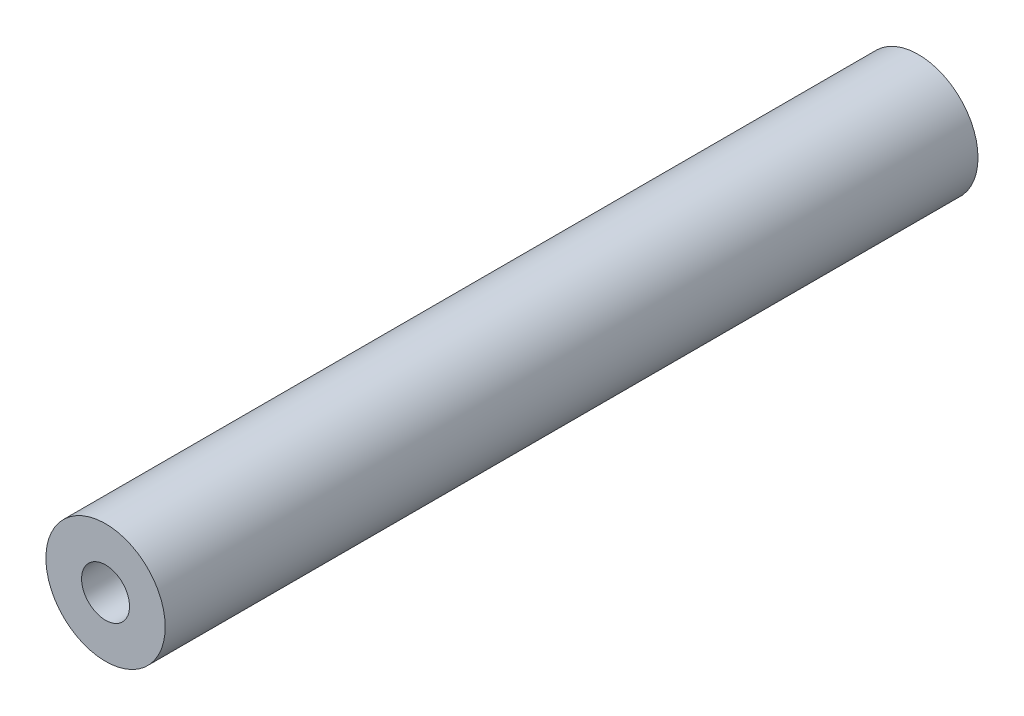
ISO-10303-21;
HEADER;
FILE_DESCRIPTION(('STEP AP214'),'2;1');
FILE_NAME('part.step','',(''),(''),'','','');
FILE_SCHEMA(('AUTOMOTIVE_DESIGN { 1 0 10303 214 1 1 1 1 }'));
ENDSEC;
DATA;
#1=APPLICATION_CONTEXT('core data for automotive mechanical design processes');
#2=APPLICATION_PROTOCOL_DEFINITION('international standard','automotive_design',2000,#1);
#3=PRODUCT_CONTEXT('',#1,'mechanical');
#4=PRODUCT('Part','Part','',(#3));
#5=PRODUCT_RELATED_PRODUCT_CATEGORY('part','',(#4));
#6=PRODUCT_DEFINITION_FORMATION('','',#4);
#7=PRODUCT_DEFINITION_CONTEXT('part definition',#1,'design');
#8=PRODUCT_DEFINITION('design','',#6,#7);
#9=PRODUCT_DEFINITION_SHAPE('','',#8);
#10=(LENGTH_UNIT() NAMED_UNIT(*) SI_UNIT(.MILLI.,.METRE.));
#11=(NAMED_UNIT(*) PLANE_ANGLE_UNIT() SI_UNIT($,.RADIAN.));
#12=(NAMED_UNIT(*) SI_UNIT($,.STERADIAN.) SOLID_ANGLE_UNIT());
#13=UNCERTAINTY_MEASURE_WITH_UNIT(LENGTH_MEASURE(1.E-05),#10,'distance_accuracy_value','');
#14=(GEOMETRIC_REPRESENTATION_CONTEXT(3) GLOBAL_UNCERTAINTY_ASSIGNED_CONTEXT((#13)) GLOBAL_UNIT_ASSIGNED_CONTEXT((#10,
#11,#12)) REPRESENTATION_CONTEXT('',''));
#15=CARTESIAN_POINT('',(0.,0.,0.));
#16=DIRECTION('',(0.,0.,1.));
#17=DIRECTION('',(1.,0.,0.));
#18=AXIS2_PLACEMENT_3D('',#15,#16,#17);
#19=CARTESIAN_POINT('',(0.,0.,43.258347316));
#20=DIRECTION('',(0.,0.,-1.));
#21=DIRECTION('',(-1.,0.,0.));
#22=AXIS2_PLACEMENT_3D('',#19,#20,#21);
#23=CYLINDRICAL_SURFACE('',#22,6.35);
#24=CARTESIAN_POINT('',(0.,0.,43.258347316));
#25=DIRECTION('',(0.,0.,1.));
#26=DIRECTION('',(1.,0.,0.));
#27=AXIS2_PLACEMENT_3D('',#24,#25,#26);
#28=CIRCLE('',#27,6.35);
#29=CARTESIAN_POINT('',(6.35,0.,43.258347316));
#30=VERTEX_POINT('',#29);
#31=EDGE_CURVE('E11',#30,#30,#28,.T.);
#32=ORIENTED_EDGE('',*,*,#31,.F.);
#33=EDGE_LOOP('',(#32));
#34=FACE_BOUND('',#33,.T.);
#35=CARTESIAN_POINT('',(0.,0.,-43.258347316));
#36=DIRECTION('',(0.,0.,1.));
#37=DIRECTION('',(1.,0.,0.));
#38=AXIS2_PLACEMENT_3D('',#35,#36,#37);
#39=CIRCLE('',#38,6.35);
#40=CARTESIAN_POINT('',(6.35,0.,-43.258347316));
#41=VERTEX_POINT('',#40);
#42=EDGE_CURVE('E38',#41,#41,#39,.T.);
#43=ORIENTED_EDGE('',*,*,#42,.T.);
#44=EDGE_LOOP('',(#43));
#45=FACE_BOUND('',#44,.T.);
#46=ADVANCED_FACE('F35',(#34,#45),#23,.T.);
#47=CARTESIAN_POINT('',(0.,0.,43.258347316));
#48=DIRECTION('',(0.,0.,1.));
#49=DIRECTION('',(1.,0.,0.));
#50=AXIS2_PLACEMENT_3D('',#47,#48,#49);
#51=PLANE('',#50);
#52=CARTESIAN_POINT('',(0.,0.,43.258347316));
#53=DIRECTION('',(0.,0.,1.));
#54=DIRECTION('',(1.,0.,0.));
#55=AXIS2_PLACEMENT_3D('',#52,#53,#54);
#56=CIRCLE('',#55,2.55269999999999);
#57=CARTESIAN_POINT('',(2.55269999999999,0.,43.258347316));
#58=VERTEX_POINT('',#57);
#59=EDGE_CURVE('E58',#58,#58,#56,.T.);
#60=ORIENTED_EDGE('',*,*,#59,.F.);
#61=EDGE_LOOP('',(#60));
#62=FACE_BOUND('',#61,.T.);
#63=ORIENTED_EDGE('',*,*,#31,.T.);
#64=EDGE_LOOP('',(#63));
#65=FACE_BOUND('',#64,.T.);
#66=ADVANCED_FACE('F77',(#62,#65),#51,.T.);
#67=CARTESIAN_POINT('',(0.,0.,-43.258347316));
#68=DIRECTION('',(0.,0.,1.));
#69=DIRECTION('',(1.,0.,0.));
#70=AXIS2_PLACEMENT_3D('',#67,#68,#69);
#71=PLANE('',#70);
#72=CARTESIAN_POINT('',(0.,0.,-43.258347316));
#73=DIRECTION('',(0.,0.,-1.));
#74=DIRECTION('',(-1.,0.,0.));
#75=AXIS2_PLACEMENT_3D('',#72,#73,#74);
#76=CIRCLE('',#75,2.55269999999999);
#77=CARTESIAN_POINT('',(-2.55269999999999,0.,-43.258347316));
#78=VERTEX_POINT('',#77);
#79=EDGE_CURVE('E59',#78,#78,#76,.T.);
#80=ORIENTED_EDGE('',*,*,#79,.F.);
#81=EDGE_LOOP('',(#80));
#82=FACE_BOUND('',#81,.T.);
#83=ORIENTED_EDGE('',*,*,#42,.F.);
#84=EDGE_LOOP('',(#83));
#85=FACE_BOUND('',#84,.T.);
#86=ADVANCED_FACE('F74',(#82,#85),#71,.F.);
#87=CARTESIAN_POINT('',(0.,0.,27.383347316));
#88=DIRECTION('',(0.,0.,1.));
#89=DIRECTION('',(1.,0.,0.));
#90=AXIS2_PLACEMENT_3D('',#87,#88,#89);
#91=CONICAL_SURFACE('',#90,2.5527,1.02974425867665);
#92=CARTESIAN_POINT('',(0.,0.,25.8495304138083));
#93=VERTEX_POINT('',#92);
#94=VERTEX_LOOP('',#93);
#95=FACE_BOUND('',#94,.T.);
#96=CARTESIAN_POINT('',(0.,0.,27.383347316));
#97=DIRECTION('',(0.,0.,1.));
#98=DIRECTION('',(1.,0.,0.));
#99=AXIS2_PLACEMENT_3D('',#96,#97,#98);
#100=CIRCLE('',#99,2.5527);
#101=CARTESIAN_POINT('',(2.5527,0.,27.383347316));
#102=VERTEX_POINT('',#101);
#103=EDGE_CURVE('E62',#102,#102,#100,.T.);
#104=ORIENTED_EDGE('',*,*,#103,.T.);
#105=EDGE_LOOP('',(#104));
#106=FACE_BOUND('',#105,.T.);
#107=ADVANCED_FACE('F76',(#95,#106),#91,.F.);
#108=CARTESIAN_POINT('',(0.,0.,43.258347316));
#109=DIRECTION('',(0.,0.,1.));
#110=DIRECTION('',(1.,0.,0.));
#111=AXIS2_PLACEMENT_3D('',#108,#109,#110);
#112=CYLINDRICAL_SURFACE('',#111,2.55269999999999);
#113=ORIENTED_EDGE('',*,*,#103,.F.);
#114=EDGE_LOOP('',(#113));
#115=FACE_BOUND('',#114,.T.);
#116=ORIENTED_EDGE('',*,*,#59,.T.);
#117=EDGE_LOOP('',(#116));
#118=FACE_BOUND('',#117,.T.);
#119=ADVANCED_FACE('F52',(#115,#118),#112,.F.);
#120=CARTESIAN_POINT('',(0.,0.,-27.383347316));
#121=DIRECTION('',(0.,0.,-1.));
#122=DIRECTION('',(-1.,0.,0.));
#123=AXIS2_PLACEMENT_3D('',#120,#121,#122);
#124=CONICAL_SURFACE('',#123,2.5527,1.02974425867665);
#125=CARTESIAN_POINT('',(0.,0.,-25.8495304138083));
#126=VERTEX_POINT('',#125);
#127=VERTEX_LOOP('',#126);
#128=FACE_BOUND('',#127,.T.);
#129=CARTESIAN_POINT('',(0.,0.,-27.383347316));
#130=DIRECTION('',(0.,0.,-1.));
#131=DIRECTION('',(-1.,0.,0.));
#132=AXIS2_PLACEMENT_3D('',#129,#130,#131);
#133=CIRCLE('',#132,2.5527);
#134=CARTESIAN_POINT('',(-2.5527,0.,-27.383347316));
#135=VERTEX_POINT('',#134);
#136=EDGE_CURVE('E56',#135,#135,#133,.T.);
#137=ORIENTED_EDGE('',*,*,#136,.T.);
#138=EDGE_LOOP('',(#137));
#139=FACE_BOUND('',#138,.T.);
#140=ADVANCED_FACE('F48',(#128,#139),#124,.F.);
#141=CARTESIAN_POINT('',(0.,0.,-43.258347316));
#142=DIRECTION('',(0.,0.,-1.));
#143=DIRECTION('',(-1.,0.,0.));
#144=AXIS2_PLACEMENT_3D('',#141,#142,#143);
#145=CYLINDRICAL_SURFACE('',#144,2.55269999999999);
#146=ORIENTED_EDGE('',*,*,#136,.F.);
#147=EDGE_LOOP('',(#146));
#148=FACE_BOUND('',#147,.T.);
#149=ORIENTED_EDGE('',*,*,#79,.T.);
#150=EDGE_LOOP('',(#149));
#151=FACE_BOUND('',#150,.T.);
#152=ADVANCED_FACE('F51',(#148,#151),#145,.F.);
#153=CLOSED_SHELL('',(#46,#66,#86,#107,#119,#140,#152));
#154=MANIFOLD_SOLID_BREP('B2',#153);
#155=ADVANCED_BREP_SHAPE_REPRESENTATION('',(#18,#154),#14);
#156=SHAPE_DEFINITION_REPRESENTATION(#9,#155);
ENDSEC;
END-ISO-10303-21;
